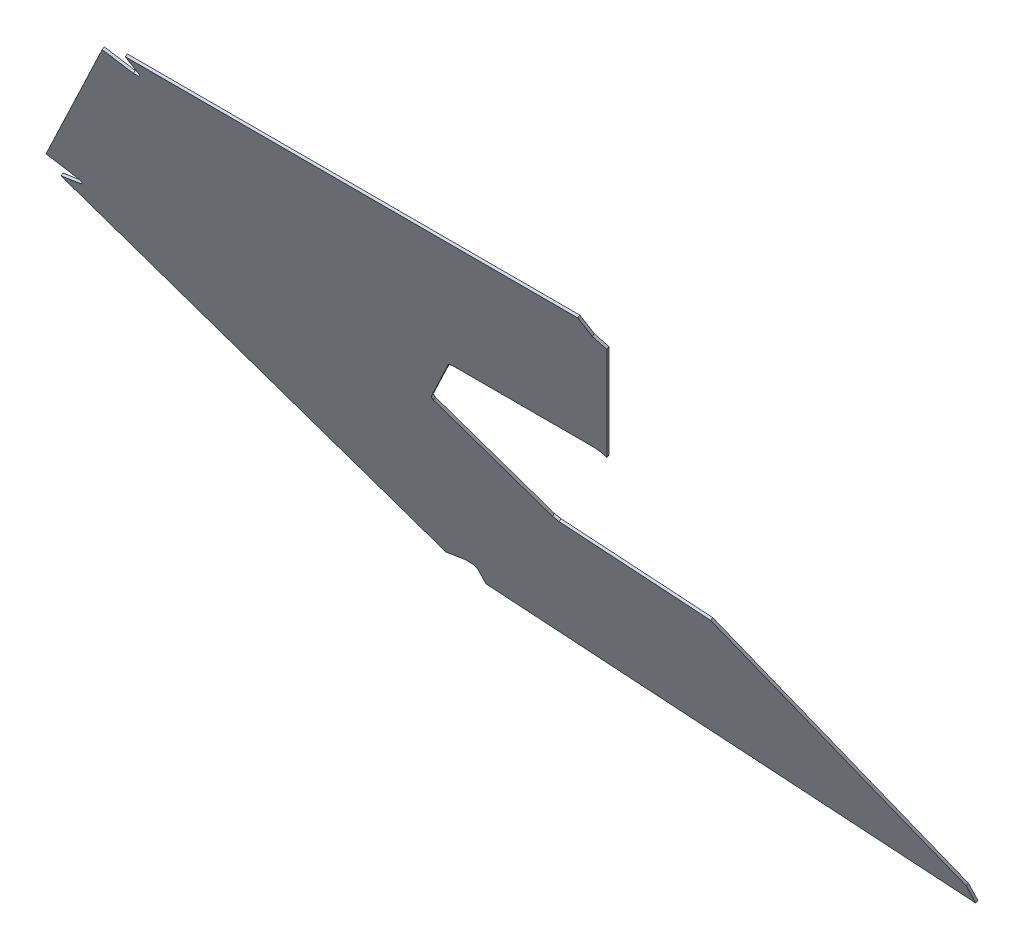
ISO-10303-21;
HEADER;
FILE_DESCRIPTION(('STEP AP214'),'2;1');
FILE_NAME('part.step','',(''),(''),'','','');
FILE_SCHEMA(('AUTOMOTIVE_DESIGN { 1 0 10303 214 1 1 1 1 }'));
ENDSEC;
DATA;
#1=APPLICATION_CONTEXT('core data for automotive mechanical design processes');
#2=APPLICATION_PROTOCOL_DEFINITION('international standard','automotive_design',2000,#1);
#3=PRODUCT_CONTEXT('',#1,'mechanical');
#4=PRODUCT('Part','Part','',(#3));
#5=PRODUCT_RELATED_PRODUCT_CATEGORY('part','',(#4));
#6=PRODUCT_DEFINITION_FORMATION('','',#4);
#7=PRODUCT_DEFINITION_CONTEXT('part definition',#1,'design');
#8=PRODUCT_DEFINITION('design','',#6,#7);
#9=PRODUCT_DEFINITION_SHAPE('','',#8);
#10=(LENGTH_UNIT() NAMED_UNIT(*) SI_UNIT(.MILLI.,.METRE.));
#11=(NAMED_UNIT(*) PLANE_ANGLE_UNIT() SI_UNIT($,.RADIAN.));
#12=(NAMED_UNIT(*) SI_UNIT($,.STERADIAN.) SOLID_ANGLE_UNIT());
#13=UNCERTAINTY_MEASURE_WITH_UNIT(LENGTH_MEASURE(1.E-05),#10,'distance_accuracy_value','');
#14=(GEOMETRIC_REPRESENTATION_CONTEXT(3) GLOBAL_UNCERTAINTY_ASSIGNED_CONTEXT((#13)) GLOBAL_UNIT_ASSIGNED_CONTEXT((#10,
#11,#12)) REPRESENTATION_CONTEXT('',''));
#15=CARTESIAN_POINT('',(0.,0.,0.));
#16=DIRECTION('',(0.,0.,1.));
#17=DIRECTION('',(1.,0.,0.));
#18=AXIS2_PLACEMENT_3D('',#15,#16,#17);
#19=CARTESIAN_POINT('',(-135.924925472236,149.206491038012,138.895088820437));
#20=DIRECTION('',(0.,-0.84861809948623,-0.529005974658491));
#21=DIRECTION('',(0.,0.529005974658491,-0.84861809948623));
#22=AXIS2_PLACEMENT_3D('',#19,#20,#21);
#23=PLANE('',#22);
#24=DIRECTION('',(0.,-0.529005974658491,0.84861809948623));
#25=VECTOR('',#24,1.);
#26=CARTESIAN_POINT('',(-137.927159041104,149.206491038012,138.895088820437));
#27=LINE('',#26,#25);
#28=CARTESIAN_POINT('',(-137.927159041104,150.,137.622161671208));
#29=VERTEX_POINT('',#28);
#30=CARTESIAN_POINT('',(-137.927159041104,149.206491038012,138.895088820437));
#31=VERTEX_POINT('',#30);
#32=EDGE_CURVE('E511',#29,#31,#27,.T.);
#33=ORIENTED_EDGE('',*,*,#32,.F.);
#34=DIRECTION('',(-1.,0.,0.));
#35=VECTOR('',#34,1.);
#36=CARTESIAN_POINT('',(-138.705215857703,150.,137.622161671208));
#37=LINE('',#36,#35);
#38=CARTESIAN_POINT('',(-141.48550624317,150.,137.622161671208));
#39=VERTEX_POINT('',#38);
#40=EDGE_CURVE('E497',#29,#39,#37,.T.);
#41=ORIENTED_EDGE('',*,*,#40,.T.);
#42=DIRECTION('',(0.,0.529005974658491,-0.84861809948623));
#43=VECTOR('',#42,1.);
#44=CARTESIAN_POINT('',(-141.48550624317,149.206491038012,138.895088820437));
#45=LINE('',#44,#43);
#46=CARTESIAN_POINT('',(-141.48550624317,149.206491038012,138.895088820437));
#47=VERTEX_POINT('',#46);
#48=EDGE_CURVE('E546',#47,#39,#45,.T.);
#49=ORIENTED_EDGE('',*,*,#48,.F.);
#50=DIRECTION('',(-1.,0.,0.));
#51=VECTOR('',#50,1.);
#52=CARTESIAN_POINT('',(-138.705215857703,149.206491038012,138.895088820437));
#53=LINE('',#52,#51);
#54=EDGE_CURVE('E507',#31,#47,#53,.T.);
#55=ORIENTED_EDGE('',*,*,#54,.F.);
#56=EDGE_LOOP('',(#33,#41,#49,#55));
#57=FACE_BOUND('',#56,.T.);
#58=ADVANCED_FACE('F295',(#57),#23,.F.);
#59=CARTESIAN_POINT('',(-291.319838155065,-42.0353497129346,19.6800067674046));
#60=DIRECTION('',(0.826670440896687,-0.477505861416198,-0.297664466238164));
#61=DIRECTION('',(0.500178684377504,0.86592221572979,0.));
#62=AXIS2_PLACEMENT_3D('',#59,#60,#61);
#63=PLANE('',#62);
#64=DIRECTION('',(0.,-0.529005974658488,0.848618099486231));
#65=VECTOR('',#64,1.);
#66=CARTESIAN_POINT('',(-292.446473825343,-43.4399791951513,18.8043980704843));
#67=LINE('',#66,#65);
#68=CARTESIAN_POINT('',(-292.446473825343,-42.6464702331635,17.5314709212548));
#69=VERTEX_POINT('',#68);
#70=CARTESIAN_POINT('',(-292.446473825343,-43.4399791951513,18.8043980704843));
#71=VERTEX_POINT('',#70);
#72=EDGE_CURVE('E539',#69,#71,#67,.T.);
#73=ORIENTED_EDGE('',*,*,#72,.F.);
#74=DIRECTION('',(-0.562686397692068,-0.701527498455186,-0.437313602307923));
#75=VECTOR('',#74,1.);
#76=CARTESIAN_POINT('',(-292.884232786359,-43.1922448424441,17.1912495315613));
#77=LINE('',#76,#75);
#78=CARTESIAN_POINT('',(-294.448627417653,-45.1426489339414,15.9754194449474));
#79=VERTEX_POINT('',#78);
#80=EDGE_CURVE('E547',#69,#79,#77,.T.);
#81=ORIENTED_EDGE('',*,*,#80,.T.);
#82=DIRECTION('',(0.,0.529005974658494,-0.848618099486227));
#83=VECTOR('',#82,1.);
#84=CARTESIAN_POINT('',(-294.448627417653,-45.9361578959292,17.2483465941768));
#85=LINE('',#84,#83);
#86=CARTESIAN_POINT('',(-294.448627417653,-45.9361578959292,17.2483465941768));
#87=VERTEX_POINT('',#86);
#88=EDGE_CURVE('E553',#87,#79,#85,.T.);
#89=ORIENTED_EDGE('',*,*,#88,.F.);
#90=DIRECTION('',(-0.562686397692068,-0.701527498455186,-0.437313602307923));
#91=VECTOR('',#90,1.);
#92=CARTESIAN_POINT('',(-292.884232786359,-43.9857538044319,18.4641766807907));
#93=LINE('',#92,#91);
#94=EDGE_CURVE('E550',#71,#87,#93,.T.);
#95=ORIENTED_EDGE('',*,*,#94,.F.);
#96=EDGE_LOOP('',(#73,#81,#89,#95));
#97=FACE_BOUND('',#96,.T.);
#98=ADVANCED_FACE('F836',(#97),#63,.F.);
#99=CARTESIAN_POINT('',(-192.472405328385,-258.661522412895,-115.358993337661));
#100=DIRECTION('',(0.930326469148009,0.311215761092928,0.194003636177128));
#101=DIRECTION('',(-0.317243123483603,0.948344241613966,0.));
#102=AXIS2_PLACEMENT_3D('',#99,#100,#101);
#103=PLANE('',#102);
#104=DIRECTION('',(0.,-0.529005974658494,0.848618099486228));
#105=VECTOR('',#104,1.);
#106=CARTESIAN_POINT('',(-191.738105450346,-260.242303862646,-116.344410490623));
#107=LINE('',#106,#105);
#108=CARTESIAN_POINT('',(-191.738105450346,-259.448794900658,-117.617337639852));
#109=VERTEX_POINT('',#108);
#110=CARTESIAN_POINT('',(-191.738105450346,-260.242303862646,-116.344410490623));
#111=VERTEX_POINT('',#110);
#112=EDGE_CURVE('E812',#109,#111,#107,.T.);
#113=ORIENTED_EDGE('',*,*,#112,.F.);
#114=DIRECTION('',(0.366732410352014,-0.789491880150111,-0.492148260562246));
#115=VECTOR('',#114,1.);
#116=CARTESIAN_POINT('',(-191.452834015736,-260.062919736386,-118.000166744585));
#117=LINE('',#116,#115);
#118=CARTESIAN_POINT('',(-190.433262703087,-262.257826021865,-119.368413002279));
#119=VERTEX_POINT('',#118);
#120=EDGE_CURVE('E554',#109,#119,#117,.T.);
#121=ORIENTED_EDGE('',*,*,#120,.T.);
#122=DIRECTION('',(0.,0.529005974658501,-0.848618099486223));
#123=VECTOR('',#122,1.);
#124=CARTESIAN_POINT('',(-190.433262703087,-263.051334983853,-118.09548585305));
#125=LINE('',#124,#123);
#126=CARTESIAN_POINT('',(-190.433262703087,-263.051334983853,-118.09548585305));
#127=VERTEX_POINT('',#126);
#128=EDGE_CURVE('E561',#127,#119,#125,.T.);
#129=ORIENTED_EDGE('',*,*,#128,.F.);
#130=DIRECTION('',(0.366732410352014,-0.789491880150111,-0.492148260562246));
#131=VECTOR('',#130,1.);
#132=CARTESIAN_POINT('',(-191.452834015736,-260.856428698374,-116.727239595355));
#133=LINE('',#132,#131);
#134=EDGE_CURVE('E558',#111,#127,#133,.T.);
#135=ORIENTED_EDGE('',*,*,#134,.F.);
#136=EDGE_LOOP('',(#113,#121,#129,#135));
#137=FACE_BOUND('',#136,.T.);
#138=ADVANCED_FACE('F863',(#137),#103,.F.);
#139=CARTESIAN_POINT('',(-61.7005414039403,-130.38739208721,-37.1638884057911));
#140=DIRECTION('',(0.930326469148015,0.311215761092918,0.19400363617712));
#141=DIRECTION('',(-0.366732410352,0.789491880150122,0.492148260562239));
#142=AXIS2_PLACEMENT_3D('',#139,#140,#141);
#143=PLANE('',#142);
#144=DIRECTION('',(0.,-0.529005974658493,0.848618099486229));
#145=VECTOR('',#144,1.);
#146=CARTESIAN_POINT('',(-62.3229953333624,-129.047389651716,-36.3285664925978));
#147=LINE('',#146,#145);
#148=CARTESIAN_POINT('',(-62.3229953333623,-129.047389651716,-36.3285664925978));
#149=VERTEX_POINT('',#148);
#150=CARTESIAN_POINT('',(-62.3229953333623,-129.840898613704,-35.0556393433685));
#151=VERTEX_POINT('',#150);
#152=EDGE_CURVE('E570',#149,#151,#147,.T.);
#153=ORIENTED_EDGE('',*,*,#152,.F.);
#154=DIRECTION('',(-0.366732410352,0.789491880150122,0.492148260562239));
#155=VECTOR('',#154,1.);
#156=CARTESIAN_POINT('',(-61.7005414039403,-130.38739208721,-37.1638884057911));
#157=LINE('',#156,#155);
#158=CARTESIAN_POINT('',(-92.9838071737008,-63.0416009527465,4.81768834799605));
#159=VERTEX_POINT('',#158);
#160=EDGE_CURVE('E574',#149,#159,#157,.T.);
#161=ORIENTED_EDGE('',*,*,#160,.T.);
#162=DIRECTION('',(0.,-0.529005974658492,0.848618099486229));
#163=VECTOR('',#162,1.);
#164=CARTESIAN_POINT('',(-92.9838071737008,-63.0416009527465,4.81768834799604));
#165=LINE('',#164,#163);
#166=CARTESIAN_POINT('',(-92.9838071737008,-63.8351099147342,6.09061549722537));
#167=VERTEX_POINT('',#166);
#168=EDGE_CURVE('E566',#159,#167,#165,.T.);
#169=ORIENTED_EDGE('',*,*,#168,.T.);
#170=DIRECTION('',(0.366732410352001,-0.789491880150122,-0.492148260562239));
#171=VECTOR('',#170,1.);
#172=CARTESIAN_POINT('',(-77.4274400665708,-97.3244475599271,-14.7857477483715));
#173=LINE('',#172,#171);
#174=EDGE_CURVE('E573',#151,#167,#173,.F.);
#175=ORIENTED_EDGE('',*,*,#174,.F.);
#176=EDGE_LOOP('',(#153,#161,#169,#175));
#177=FACE_BOUND('',#176,.T.);
#178=ADVANCED_FACE('F871',(#177),#143,.T.);
#179=CARTESIAN_POINT('',(-56.3241818783111,-90.2649186994679,-10.3850250349177));
#180=DIRECTION('',(0.,-0.529005974658493,0.848618099486229));
#181=DIRECTION('',(-0.930326469148015,-0.311215761092918,-0.19400363617712));
#182=AXIS2_PLACEMENT_3D('',#179,#180,#181);
#183=PLANE('',#182);
#184=DIRECTION('',(-0.562686397692096,-0.701527498455173,-0.437313602307909));
#185=VECTOR('',#184,1.);
#186=CARTESIAN_POINT('',(-137.489357053772,149.752319290217,139.235343649704));
#187=LINE('',#186,#185);
#188=CARTESIAN_POINT('',(-135.924925472236,151.702769449313,140.451202453635));
#189=VERTEX_POINT('',#188);
#190=EDGE_CURVE('E521',#189,#31,#187,.T.);
#191=ORIENTED_EDGE('',*,*,#190,.T.);
#192=ORIENTED_EDGE('',*,*,#54,.T.);
#193=DIRECTION('',(-0.826670440896674,0.477505861416217,0.297664466238173));
#194=VECTOR('',#193,1.);
#195=CARTESIAN_POINT('',(-154.606896724331,156.785739738243,143.619791072572));
#196=LINE('',#195,#194);
#197=CARTESIAN_POINT('',(-155.226899555003,157.143869134305,143.84303942225));
#198=VERTEX_POINT('',#197);
#199=EDGE_CURVE('E700',#47,#198,#196,.T.);
#200=ORIENTED_EDGE('',*,*,#199,.T.);
#201=DIRECTION('',(0.562686397692089,0.701527498455176,0.437313602307913));
#202=VECTOR('',#201,1.);
#203=CARTESIAN_POINT('',(-231.359924314881,62.2252597122773,84.6733003830657));
#204=LINE('',#203,#202);
#205=CARTESIAN_POINT('',(-307.492949074759,-32.6933497097506,25.5035613438811));
#206=VERTEX_POINT('',#205);
#207=EDGE_CURVE('E693',#198,#206,#204,.F.);
#208=ORIENTED_EDGE('',*,*,#207,.T.);
#209=DIRECTION('',(-0.826670440896674,0.477505861416217,0.297664466238173));
#210=VECTOR('',#209,1.);
#211=CARTESIAN_POINT('',(-306.872946244087,-33.0514791058127,25.2803129942025));
#212=LINE('',#211,#210);
#213=CARTESIAN_POINT('',(-293.751368698165,-40.6308358594047,20.5555433844736));
#214=VERTEX_POINT('',#213);
#215=EDGE_CURVE('E697',#206,#214,#212,.F.);
#216=ORIENTED_EDGE('',*,*,#215,.T.);
#217=DIRECTION('',(0.366732410351994,-0.789491880150125,-0.492148260562239));
#218=VECTOR('',#217,1.);
#219=CARTESIAN_POINT('',(-292.731773301356,-42.8257939926283,19.1872648062728));
#220=LINE('',#219,#218);
#221=EDGE_CURVE('E529',#214,#71,#220,.T.);
#222=ORIENTED_EDGE('',*,*,#221,.T.);
#223=ORIENTED_EDGE('',*,*,#94,.T.);
#224=DIRECTION('',(0.930326469148015,0.311215761092918,0.19400363617712));
#225=VECTOR('',#224,1.);
#226=CARTESIAN_POINT('',(-300.11495995718,-47.8316774284533,16.0667300832936));
#227=LINE('',#226,#225);
#228=CARTESIAN_POINT('',(-309.913231713534,-51.109426372694,14.0234684842495));
#229=VERTEX_POINT('',#228);
#230=EDGE_CURVE('E582',#229,#87,#227,.T.);
#231=ORIENTED_EDGE('',*,*,#230,.F.);
#232=DIRECTION('',(0.366732410352,-0.789491880150123,-0.492148260562239));
#233=VECTOR('',#232,1.);
#234=CARTESIAN_POINT('',(-260.293345425453,-157.929811516215,-52.5655212986167));
#235=LINE('',#234,#233);
#236=CARTESIAN_POINT('',(-210.673459137371,-264.750196659736,-119.154511081483));
#237=VERTEX_POINT('',#236);
#238=EDGE_CURVE('E605',#229,#237,#235,.T.);
#239=ORIENTED_EDGE('',*,*,#238,.T.);
#240=DIRECTION('',(0.930326469148015,0.311215761092914,0.194003636177126));
#241=VECTOR('',#240,1.);
#242=CARTESIAN_POINT('',(-209.97571428551,-264.516784838917,-119.00900835435));
#243=LINE('',#242,#241);
#244=CARTESIAN_POINT('',(-195.208644317869,-259.576857757942,-115.929589070464));
#245=VERTEX_POINT('',#244);
#246=EDGE_CURVE('E586',#237,#245,#243,.T.);
#247=ORIENTED_EDGE('',*,*,#246,.T.);
#248=DIRECTION('',(0.97541185463204,-0.187026869291456,-0.116587580840848));
#249=VECTOR('',#248,1.);
#250=CARTESIAN_POINT('',(-192.496852512923,-260.096820611624,-116.253720097559));
#251=LINE('',#250,#249);
#252=EDGE_CURVE('E538',#245,#111,#251,.T.);
#253=ORIENTED_EDGE('',*,*,#252,.T.);
#254=ORIENTED_EDGE('',*,*,#134,.T.);
#255=DIRECTION('',(0.220389913206769,0.827752154294173,0.515998698853078));
#256=VECTOR('',#255,1.);
#257=CARTESIAN_POINT('',(-193.931511303352,-276.190243080837,-126.285932047871));
#258=LINE('',#257,#256);
#259=CARTESIAN_POINT('',(-194.096803738257,-276.811057196558,-126.672931072011));
#260=VERTEX_POINT('',#259);
#261=EDGE_CURVE('E640',#127,#260,#258,.F.);
#262=ORIENTED_EDGE('',*,*,#261,.T.);
#263=DIRECTION('',(0.975411854632038,-0.187026869291462,-0.116587580840849));
#264=VECTOR('',#263,1.);
#265=CARTESIAN_POINT('',(-62.0247204976167,-302.134748037507,-142.459047068568));
#266=LINE('',#265,#264);
#267=CARTESIAN_POINT('',(70.0473627430238,-327.458438878456,-158.245163065124));
#268=VERTEX_POINT('',#267);
#269=EDGE_CURVE('E633',#260,#268,#266,.T.);
#270=ORIENTED_EDGE('',*,*,#269,.T.);
#271=DIRECTION('',(0.220389913206769,0.827752154294173,0.515998698853078));
#272=VECTOR('',#271,1.);
#273=CARTESIAN_POINT('',(70.2126551779289,-326.837624762735,-157.858164040984));
#274=LINE('',#273,#272);
#275=CARTESIAN_POINT('',(74.3591057733041,-311.264165147203,-148.150083117767));
#276=VERTEX_POINT('',#275);
#277=EDGE_CURVE('E637',#268,#276,#274,.T.);
#278=ORIENTED_EDGE('',*,*,#277,.T.);
#279=DIRECTION('',(0.261313668298405,-0.819131963238155,-0.510625100795131));
#280=VECTOR('',#279,1.);
#281=CARTESIAN_POINT('',(22.1064989521357,-147.469516790509,-46.0448515062358));
#282=LINE('',#281,#280);
#283=CARTESIAN_POINT('',(22.1064989521357,-147.469516790509,-46.0448515062358));
#284=VERTEX_POINT('',#283);
#285=EDGE_CURVE('E655',#284,#276,#282,.T.);
#286=ORIENTED_EDGE('',*,*,#285,.F.);
#287=DIRECTION('',(0.975411854632038,-0.187026869291462,-0.116587580840849));
#288=VECTOR('',#287,1.);
#289=CARTESIAN_POINT('',(-19.4617963315954,-139.499152178084,-41.0763379867476));
#290=LINE('',#289,#288);
#291=CARTESIAN_POINT('',(-59.6356507129541,-131.796159666114,-36.2744971303618));
#292=VERTEX_POINT('',#291);
#293=EDGE_CURVE('E615',#284,#292,#290,.F.);
#294=ORIENTED_EDGE('',*,*,#293,.T.);
#295=DIRECTION('',(0.759170788013354,-0.552358288050502,-0.344325480104366));
#296=VECTOR('',#295,1.);
#297=CARTESIAN_POINT('',(-62.3229953333624,-129.840898613704,-35.0556393433685));
#298=LINE('',#297,#296);
#299=EDGE_CURVE('E611',#151,#292,#298,.T.);
#300=ORIENTED_EDGE('',*,*,#299,.F.);
#301=ORIENTED_EDGE('',*,*,#174,.T.);
#302=DIRECTION('',(-0.110837710492343,-0.84338935522615,-0.525746514419292));
#303=VECTOR('',#302,1.);
#304=CARTESIAN_POINT('',(-92.5914674242177,-60.8497075018166,7.951636036558));
#305=LINE('',#304,#303);
#306=CARTESIAN_POINT('',(-92.5914674242178,-60.8497075018166,7.95163603655801));
#307=VERTEX_POINT('',#306);
#308=EDGE_CURVE('E672',#307,#167,#305,.T.);
#309=ORIENTED_EDGE('',*,*,#308,.F.);
#310=DIRECTION('',(0.562686397692089,0.701527498455176,0.437313602307913));
#311=VECTOR('',#310,1.);
#312=CARTESIAN_POINT('',(-69.4163185592819,-31.9561634669359,25.9631036599377));
#313=LINE('',#312,#311);
#314=CARTESIAN_POINT('',(-45.5477742728823,-2.19813086887885,44.5134704833476));
#315=VERTEX_POINT('',#314);
#316=EDGE_CURVE('E710',#307,#315,#313,.T.);
#317=ORIENTED_EDGE('',*,*,#316,.T.);
#318=DIRECTION('',(-0.88393619613977,-0.396820212544078,-0.247367176622984));
#319=VECTOR('',#318,1.);
#320=CARTESIAN_POINT('',(-42.4189111098094,-0.793508961987762,45.3890744580112));
#321=LINE('',#320,#319);
#322=CARTESIAN_POINT('',(-42.4189111098094,-0.793508961987748,45.3890744580112));
#323=VERTEX_POINT('',#322);
#324=EDGE_CURVE('E717',#323,#315,#321,.T.);
#325=ORIENTED_EDGE('',*,*,#324,.F.);
#326=DIRECTION('',(1.,0.,0.));
#327=VECTOR('',#326,1.);
#328=CARTESIAN_POINT('',(0.,-0.793508961987745,45.3890744580112));
#329=LINE('',#328,#327);
#330=CARTESIAN_POINT('',(43.6866164883155,-0.793508961987745,45.3890744580112));
#331=VERTEX_POINT('',#330);
#332=EDGE_CURVE('E754',#323,#331,#329,.T.);
#333=ORIENTED_EDGE('',*,*,#332,.T.);
#334=DIRECTION('',(-0.883943798762416,0.396808016367884,0.247359573850809));
#335=VECTOR('',#334,1.);
#336=CARTESIAN_POINT('',(46.8155722112643,-2.19811716837434,44.5134790238781));
#337=LINE('',#336,#335);
#338=CARTESIAN_POINT('',(46.8155722112642,-2.19811716837429,44.5134790238782));
#339=VERTEX_POINT('',#338);
#340=EDGE_CURVE('E761',#339,#331,#337,.T.);
#341=ORIENTED_EDGE('',*,*,#340,.F.);
#342=DIRECTION('',(-0.562718053530531,0.7015092124855,0.437302203320296));
#343=VECTOR('',#342,1.);
#344=CARTESIAN_POINT('',(70.685424919751,-31.9553312307571,25.9636224538582));
#345=LINE('',#344,#343);
#346=CARTESIAN_POINT('',(48.6740626445397,-4.51499353670675,43.0691998573898));
#347=VERTEX_POINT('',#346);
#348=EDGE_CURVE('E791',#339,#347,#345,.F.);
#349=ORIENTED_EDGE('',*,*,#348,.T.);
#350=DIRECTION('',(-0.467560526394548,-0.750145354066458,-0.467620681674969));
#351=VECTOR('',#350,1.);
#352=CARTESIAN_POINT('',(142.168048282114,145.485006463293,136.575214219816));
#353=LINE('',#352,#351);
#354=CARTESIAN_POINT('',(142.168048282114,145.485006463293,136.575214219816));
#355=VERTEX_POINT('',#354);
#356=EDGE_CURVE('E775',#355,#347,#353,.T.);
#357=ORIENTED_EDGE('',*,*,#356,.F.);
#358=DIRECTION('',(-0.562718053530531,0.7015092124855,0.437302203320296));
#359=VECTOR('',#358,1.);
#360=CARTESIAN_POINT('',(216.796932952747,52.4493382711996,78.5792507118962));
#361=LINE('',#360,#359);
#362=CARTESIAN_POINT('',(137.180602125889,151.702577418082,140.451082746469));
#363=VERTEX_POINT('',#362);
#364=EDGE_CURVE('E787',#363,#355,#361,.F.);
#365=ORIENTED_EDGE('',*,*,#364,.F.);
#366=DIRECTION('',(0.,0.848618099486232,0.529005974658487));
#367=VECTOR('',#366,1.);
#368=CARTESIAN_POINT('',(137.180602125889,165.17252583816,148.847890682662));
#369=LINE('',#368,#367);
#370=CARTESIAN_POINT('',(137.180602125889,165.808989412775,149.244645163655));
#371=VERTEX_POINT('',#370);
#372=EDGE_CURVE('E745',#363,#371,#369,.T.);
#373=ORIENTED_EDGE('',*,*,#372,.T.);
#374=DIRECTION('',(1.,0.,0.));
#375=VECTOR('',#374,1.);
#376=CARTESIAN_POINT('',(0.627838326826915,165.808989412775,149.244645163655));
#377=LINE('',#376,#375);
#378=CARTESIAN_POINT('',(-135.924925472236,165.808989412775,149.244645163655));
#379=VERTEX_POINT('',#378);
#380=EDGE_CURVE('E740',#371,#379,#377,.F.);
#381=ORIENTED_EDGE('',*,*,#380,.T.);
#382=DIRECTION('',(0.,0.848618099486232,0.529005974658487));
#383=VECTOR('',#382,1.);
#384=CARTESIAN_POINT('',(-135.924925472236,165.17252583816,148.847890682662));
#385=LINE('',#384,#383);
#386=EDGE_CURVE('E313',#379,#189,#385,.F.);
#387=ORIENTED_EDGE('',*,*,#386,.T.);
#388=EDGE_LOOP('',(#191,#192,#200,#208,#216,#222,#223,#231,#239,#247,#253,#254,#262,#270,#278,
#286,#294,#300,#301,#309,#317,#325,#333,#341,#349,#357,#365,#373,#381,#387));
#389=FACE_BOUND('',#388,.T.);
#390=ADVANCED_FACE('F837',(#389),#183,.T.);
#391=CARTESIAN_POINT('',(0.,-19.8047992922429,31.770361661679));
#392=DIRECTION('',(0.,-0.529005974658493,0.848618099486228));
#393=DIRECTION('',(0.,-0.848618099486228,-0.529005974658493));
#394=AXIS2_PLACEMENT_3D('',#391,#392,#393);
#395=PLANE('',#394);
#396=ORIENTED_EDGE('',*,*,#40,.F.);
#397=DIRECTION('',(-0.562686397692096,-0.701527498455173,-0.437313602307909));
#398=VECTOR('',#397,1.);
#399=CARTESIAN_POINT('',(-137.489357053772,150.545828252205,137.962416500475));
#400=LINE('',#399,#398);
#401=CARTESIAN_POINT('',(-135.924925472236,152.496278411301,139.178275304406));
#402=VERTEX_POINT('',#401);
#403=EDGE_CURVE('E299',#402,#29,#400,.T.);
#404=ORIENTED_EDGE('',*,*,#403,.F.);
#405=DIRECTION('',(0.,-0.848618099486232,-0.529005974658487));
#406=VECTOR('',#405,1.);
#407=CARTESIAN_POINT('',(-135.924925472236,165.966034800148,147.574963533432));
#408=LINE('',#407,#406);
#409=CARTESIAN_POINT('',(-135.924925472236,166.602498374763,147.971718014426));
#410=VERTEX_POINT('',#409);
#411=EDGE_CURVE('E320',#410,#402,#408,.T.);
#412=ORIENTED_EDGE('',*,*,#411,.F.);
#413=DIRECTION('',(-1.,0.,0.));
#414=VECTOR('',#413,1.);
#415=CARTESIAN_POINT('',(0.627838326826914,166.602498374763,147.971718014426));
#416=LINE('',#415,#414);
#417=CARTESIAN_POINT('',(137.180602125889,166.602498374763,147.971718014426));
#418=VERTEX_POINT('',#417);
#419=EDGE_CURVE('E736',#418,#410,#416,.T.);
#420=ORIENTED_EDGE('',*,*,#419,.F.);
#421=DIRECTION('',(0.,0.848618099486232,0.529005974658487));
#422=VECTOR('',#421,1.);
#423=CARTESIAN_POINT('',(137.180602125889,165.966034800148,147.574963533432));
#424=LINE('',#423,#422);
#425=CARTESIAN_POINT('',(137.180602125889,152.49608638007,139.178155597239));
#426=VERTEX_POINT('',#425);
#427=EDGE_CURVE('E728',#426,#418,#424,.T.);
#428=ORIENTED_EDGE('',*,*,#427,.F.);
#429=DIRECTION('',(0.562718053530531,-0.701509212485499,-0.437302203320296));
#430=VECTOR('',#429,1.);
#431=CARTESIAN_POINT('',(139.354458014461,149.786061487709,137.488798087188));
#432=LINE('',#431,#430);
#433=CARTESIAN_POINT('',(142.168048282114,146.278515425281,135.302287070587));
#434=VERTEX_POINT('',#433);
#435=EDGE_CURVE('E779',#426,#434,#432,.T.);
#436=ORIENTED_EDGE('',*,*,#435,.T.);
#437=DIRECTION('',(-0.467560526394548,-0.750145354066458,-0.467620681674969));
#438=VECTOR('',#437,1.);
#439=CARTESIAN_POINT('',(142.168048282114,146.278515425281,135.302287070587));
#440=LINE('',#439,#438);
#441=CARTESIAN_POINT('',(48.6740626445397,-3.72148457471902,41.7962727081604));
#442=VERTEX_POINT('',#441);
#443=EDGE_CURVE('E783',#434,#442,#440,.T.);
#444=ORIENTED_EDGE('',*,*,#443,.T.);
#445=DIRECTION('',(0.562718053530531,-0.701509212485499,-0.437302203320296));
#446=VECTOR('',#445,1.);
#447=CARTESIAN_POINT('',(45.8604723768871,-0.213938512291519,43.9827837247619));
#448=LINE('',#447,#446);
#449=CARTESIAN_POINT('',(46.8155722112642,-1.40460820638655,43.2405518746489));
#450=VERTEX_POINT('',#449);
#451=EDGE_CURVE('E795',#450,#442,#448,.T.);
#452=ORIENTED_EDGE('',*,*,#451,.F.);
#453=DIRECTION('',(-0.883943798762416,0.396808016367884,0.247359573850809));
#454=VECTOR('',#453,1.);
#455=CARTESIAN_POINT('',(46.8155722112643,-1.40460820638661,43.2405518746488));
#456=LINE('',#455,#454);
#457=CARTESIAN_POINT('',(43.6866164883155,0.,44.1161473087819));
#458=VERTEX_POINT('',#457);
#459=EDGE_CURVE('E729',#450,#458,#456,.T.);
#460=ORIENTED_EDGE('',*,*,#459,.T.);
#461=DIRECTION('',(1.,0.,0.));
#462=VECTOR('',#461,1.);
#463=CARTESIAN_POINT('',(-44.1161473087819,0.,44.1161473087819));
#464=LINE('',#463,#462);
#465=CARTESIAN_POINT('',(-42.4189111098094,0.,44.1161473087819));
#466=VERTEX_POINT('',#465);
#467=EDGE_CURVE('E720',#466,#458,#464,.T.);
#468=ORIENTED_EDGE('',*,*,#467,.F.);
#469=DIRECTION('',(-0.88393619613977,-0.396820212544078,-0.247367176622984));
#470=VECTOR('',#469,1.);
#471=CARTESIAN_POINT('',(-42.4189111098094,0.,44.1161473087819));
#472=LINE('',#471,#470);
#473=CARTESIAN_POINT('',(-45.5477742728823,-1.40462190689115,43.2405433341183));
#474=VERTEX_POINT('',#473);
#475=EDGE_CURVE('E683',#466,#474,#472,.T.);
#476=ORIENTED_EDGE('',*,*,#475,.T.);
#477=DIRECTION('',(0.562686397692089,0.701527498455176,0.437313602307913));
#478=VECTOR('',#477,1.);
#479=CARTESIAN_POINT('',(-93.5464791492616,-61.2468564075388,5.93648440946993));
#480=LINE('',#479,#478);
#481=CARTESIAN_POINT('',(-92.5914674242178,-60.0561985398289,6.67870888732867));
#482=VERTEX_POINT('',#481);
#483=EDGE_CURVE('E675',#482,#474,#480,.T.);
#484=ORIENTED_EDGE('',*,*,#483,.F.);
#485=DIRECTION('',(-0.110837710492343,-0.84338935522615,-0.525746514419292));
#486=VECTOR('',#485,1.);
#487=CARTESIAN_POINT('',(-92.5914674242177,-60.0561985398289,6.67870888732867));
#488=LINE('',#487,#486);
#489=EDGE_CURVE('E623',#482,#159,#488,.T.);
#490=ORIENTED_EDGE('',*,*,#489,.T.);
#491=ORIENTED_EDGE('',*,*,#160,.F.);
#492=DIRECTION('',(0.759170788013354,-0.552358288050502,-0.344325480104366));
#493=VECTOR('',#492,1.);
#494=CARTESIAN_POINT('',(-62.3229953333624,-129.047389651716,-36.3285664925978));
#495=LINE('',#494,#493);
#496=CARTESIAN_POINT('',(-59.635650712954,-131.002650704127,-37.5474242795912));
#497=VERTEX_POINT('',#496);
#498=EDGE_CURVE('E595',#149,#497,#495,.T.);
#499=ORIENTED_EDGE('',*,*,#498,.T.);
#500=DIRECTION('',(-0.975411854632038,0.187026869291462,0.116587580840849));
#501=VECTOR('',#500,1.);
#502=CARTESIAN_POINT('',(22.1064989521357,-146.676007828521,-47.3177786554651));
#503=LINE('',#502,#501);
#504=CARTESIAN_POINT('',(22.1064989521357,-146.676007828521,-47.3177786554651));
#505=VERTEX_POINT('',#504);
#506=EDGE_CURVE('E663',#505,#497,#503,.T.);
#507=ORIENTED_EDGE('',*,*,#506,.F.);
#508=DIRECTION('',(0.261313668298405,-0.819131963238155,-0.510625100795131));
#509=VECTOR('',#508,1.);
#510=CARTESIAN_POINT('',(22.1064989521357,-146.676007828521,-47.3177786554651));
#511=LINE('',#510,#509);
#512=CARTESIAN_POINT('',(74.3591057733041,-310.470656185215,-149.423010266996));
#513=VERTEX_POINT('',#512);
#514=EDGE_CURVE('E659',#505,#513,#511,.T.);
#515=ORIENTED_EDGE('',*,*,#514,.T.);
#516=DIRECTION('',(0.220389913206769,0.827752154294173,0.515998698853077));
#517=VECTOR('',#516,1.);
#518=CARTESIAN_POINT('',(70.2126551779289,-326.044115800747,-159.131091190214));
#519=LINE('',#518,#517);
#520=CARTESIAN_POINT('',(70.0473627430238,-326.664929916468,-159.518090214353));
#521=VERTEX_POINT('',#520);
#522=EDGE_CURVE('E622',#521,#513,#519,.T.);
#523=ORIENTED_EDGE('',*,*,#522,.F.);
#524=DIRECTION('',(0.975411854632038,-0.187026869291462,-0.116587580840849));
#525=VECTOR('',#524,1.);
#526=CARTESIAN_POINT('',(-62.0247204976166,-301.341239075519,-143.731974217797));
#527=LINE('',#526,#525);
#528=CARTESIAN_POINT('',(-194.096803738257,-276.01754823457,-127.945858221241));
#529=VERTEX_POINT('',#528);
#530=EDGE_CURVE('E629',#529,#521,#527,.T.);
#531=ORIENTED_EDGE('',*,*,#530,.F.);
#532=DIRECTION('',(-0.220389913206769,-0.827752154294173,-0.515998698853077));
#533=VECTOR('',#532,1.);
#534=CARTESIAN_POINT('',(-193.931511303352,-275.39673411885,-127.558859197101));
#535=LINE('',#534,#533);
#536=EDGE_CURVE('E648',#119,#529,#535,.T.);
#537=ORIENTED_EDGE('',*,*,#536,.F.);
#538=ORIENTED_EDGE('',*,*,#120,.F.);
#539=DIRECTION('',(0.97541185463204,-0.187026869291456,-0.116587580840848));
#540=VECTOR('',#539,1.);
#541=CARTESIAN_POINT('',(-192.496852512923,-259.303311649636,-117.526647246788));
#542=LINE('',#541,#540);
#543=CARTESIAN_POINT('',(-195.208644317869,-258.783348795954,-117.202516219693));
#544=VERTEX_POINT('',#543);
#545=EDGE_CURVE('E534',#544,#109,#542,.T.);
#546=ORIENTED_EDGE('',*,*,#545,.F.);
#547=DIRECTION('',(0.930326469148015,0.311215761092914,0.194003636177126));
#548=VECTOR('',#547,1.);
#549=CARTESIAN_POINT('',(-209.97571428551,-263.723275876929,-120.281935503579));
#550=LINE('',#549,#548);
#551=CARTESIAN_POINT('',(-210.673459137371,-263.956687697749,-120.427438230712));
#552=VERTEX_POINT('',#551);
#553=EDGE_CURVE('E602',#552,#544,#550,.T.);
#554=ORIENTED_EDGE('',*,*,#553,.F.);
#555=DIRECTION('',(0.366732410352001,-0.789491880150122,-0.492148260562239));
#556=VECTOR('',#555,1.);
#557=CARTESIAN_POINT('',(-260.293345425453,-157.136302554228,-53.8384484478461));
#558=LINE('',#557,#556);
#559=CARTESIAN_POINT('',(-309.913231713534,-50.3159174107063,12.7505413350202));
#560=VERTEX_POINT('',#559);
#561=EDGE_CURVE('E594',#560,#552,#558,.T.);
#562=ORIENTED_EDGE('',*,*,#561,.F.);
#563=DIRECTION('',(0.930326469148015,0.311215761092918,0.19400363617712));
#564=VECTOR('',#563,1.);
#565=CARTESIAN_POINT('',(-300.11495995718,-47.0381684664656,14.7938029340643));
#566=LINE('',#565,#564);
#567=EDGE_CURVE('E578',#560,#79,#566,.T.);
#568=ORIENTED_EDGE('',*,*,#567,.T.);
#569=ORIENTED_EDGE('',*,*,#80,.F.);
#570=DIRECTION('',(0.366732410351994,-0.789491880150125,-0.492148260562239));
#571=VECTOR('',#570,1.);
#572=CARTESIAN_POINT('',(-292.731773301356,-42.0322850306406,17.9143376570435));
#573=LINE('',#572,#571);
#574=CARTESIAN_POINT('',(-293.751368698165,-39.837326897417,19.2826162352443));
#575=VERTEX_POINT('',#574);
#576=EDGE_CURVE('E516',#575,#69,#573,.T.);
#577=ORIENTED_EDGE('',*,*,#576,.F.);
#578=DIRECTION('',(0.826670440896674,-0.477505861416217,-0.297664466238173));
#579=VECTOR('',#578,1.);
#580=CARTESIAN_POINT('',(-306.872946244087,-32.257970143825,24.0073858449731));
#581=LINE('',#580,#579);
#582=CARTESIAN_POINT('',(-307.492949074759,-31.8998407477629,24.2306341946518));
#583=VERTEX_POINT('',#582);
#584=EDGE_CURVE('E707',#583,#575,#581,.T.);
#585=ORIENTED_EDGE('',*,*,#584,.F.);
#586=DIRECTION('',(-0.562686397692089,-0.701527498455176,-0.437313602307913));
#587=VECTOR('',#586,1.);
#588=CARTESIAN_POINT('',(-231.359924314881,63.018768674265,83.4003732338364));
#589=LINE('',#588,#587);
#590=CARTESIAN_POINT('',(-155.226899555003,157.937378096293,142.570112273021));
#591=VERTEX_POINT('',#590);
#592=EDGE_CURVE('E689',#591,#583,#589,.T.);
#593=ORIENTED_EDGE('',*,*,#592,.F.);
#594=DIRECTION('',(-0.826670440896674,0.477505861416217,0.297664466238173));
#595=VECTOR('',#594,1.);
#596=CARTESIAN_POINT('',(-154.606896724331,157.579248700231,142.346863923342));
#597=LINE('',#596,#595);
#598=EDGE_CURVE('E502',#39,#591,#597,.T.);
#599=ORIENTED_EDGE('',*,*,#598,.F.);
#600=EDGE_LOOP('',(#396,#404,#412,#420,#428,#436,#444,#452,#460,#468,#476,#484,#490,#491,#499,
#507,#515,#523,#531,#537,#538,#546,#554,#562,#568,#569,#577,#585,#593,#599));
#601=FACE_BOUND('',#600,.T.);
#602=ADVANCED_FACE('F297',(#601),#395,.F.);
#603=CARTESIAN_POINT('',(-260.293345425453,-157.136302554228,-53.8384484478461));
#604=DIRECTION('',(0.930326469148015,0.311215761092914,0.194003636177126));
#605=DIRECTION('',(0.366732410352001,-0.789491880150122,-0.492148260562239));
#606=AXIS2_PLACEMENT_3D('',#603,#604,#605);
#607=PLANE('',#606);
#608=DIRECTION('',(0.,0.529005974658495,-0.848618099486228));
#609=VECTOR('',#608,1.);
#610=CARTESIAN_POINT('',(-210.673459137371,-263.956687697749,-120.427438230712));
#611=LINE('',#610,#609);
#612=EDGE_CURVE('E599',#237,#552,#611,.T.);
#613=ORIENTED_EDGE('',*,*,#612,.F.);
#614=ORIENTED_EDGE('',*,*,#238,.F.);
#615=DIRECTION('',(0.,0.529005974658495,-0.848618099486228));
#616=VECTOR('',#615,1.);
#617=CARTESIAN_POINT('',(-309.913231713534,-50.3159174107063,12.7505413350202));
#618=LINE('',#617,#616);
#619=EDGE_CURVE('E590',#229,#560,#618,.T.);
#620=ORIENTED_EDGE('',*,*,#619,.T.);
#621=ORIENTED_EDGE('',*,*,#561,.T.);
#622=EDGE_LOOP('',(#613,#614,#620,#621));
#623=FACE_BOUND('',#622,.T.);
#624=ADVANCED_FACE('F963',(#623),#607,.F.);
#625=CARTESIAN_POINT('',(-209.97571428551,-263.723275876929,-120.281935503579));
#626=DIRECTION('',(-0.366732410352001,0.789491880150122,0.492148260562239));
#627=DIRECTION('',(0.930326469148015,0.311215761092914,0.194003636177126));
#628=AXIS2_PLACEMENT_3D('',#625,#626,#627);
#629=PLANE('',#628);
#630=ORIENTED_EDGE('',*,*,#553,.T.);
#631=DIRECTION('',(0.,0.529005974658495,-0.848618099486227));
#632=VECTOR('',#631,1.);
#633=CARTESIAN_POINT('',(-195.208644317869,-259.576857757942,-115.929589070464));
#634=LINE('',#633,#632);
#635=EDGE_CURVE('E542',#245,#544,#634,.T.);
#636=ORIENTED_EDGE('',*,*,#635,.F.);
#637=ORIENTED_EDGE('',*,*,#246,.F.);
#638=ORIENTED_EDGE('',*,*,#612,.T.);
#639=EDGE_LOOP('',(#630,#636,#637,#638));
#640=FACE_BOUND('',#639,.T.);
#641=ADVANCED_FACE('F969',(#640),#629,.F.);
#642=CARTESIAN_POINT('',(-309.215486861673,-50.0825055898866,12.896044062153));
#643=DIRECTION('',(0.366732410352001,-0.789491880150122,-0.492148260562239));
#644=DIRECTION('',(-0.930326469148015,-0.311215761092914,-0.194003636177126));
#645=AXIS2_PLACEMENT_3D('',#642,#643,#644);
#646=PLANE('',#645);
#647=ORIENTED_EDGE('',*,*,#619,.F.);
#648=ORIENTED_EDGE('',*,*,#230,.T.);
#649=ORIENTED_EDGE('',*,*,#88,.T.);
#650=ORIENTED_EDGE('',*,*,#567,.F.);
#651=EDGE_LOOP('',(#647,#648,#649,#650));
#652=FACE_BOUND('',#651,.T.);
#653=ADVANCED_FACE('F968',(#652),#646,.F.);
#654=CARTESIAN_POINT('',(-62.3229953333624,-129.44414413271,-35.6921029179832));
#655=DIRECTION('',(0.650891476843247,0.644246071309355,0.401605882645261));
#656=DIRECTION('',(0.759170788013354,-0.552358288050502,-0.344325480104366));
#657=AXIS2_PLACEMENT_3D('',#654,#655,#656);
#658=PLANE('',#657);
#659=ORIENTED_EDGE('',*,*,#152,.T.);
#660=ORIENTED_EDGE('',*,*,#299,.T.);
#661=DIRECTION('',(0.,-0.529005974658498,0.848618099486226));
#662=VECTOR('',#661,1.);
#663=CARTESIAN_POINT('',(-59.6356507129541,-131.002650704127,-37.5474242795912));
#664=LINE('',#663,#662);
#665=EDGE_CURVE('E666',#497,#292,#664,.T.);
#666=ORIENTED_EDGE('',*,*,#665,.F.);
#667=ORIENTED_EDGE('',*,*,#498,.F.);
#668=EDGE_LOOP('',(#659,#660,#666,#667));
#669=FACE_BOUND('',#668,.T.);
#670=ADVANCED_FACE('F936',(#669),#658,.T.);
#671=CARTESIAN_POINT('',(70.2126551779289,-326.044115800747,-159.131091190214));
#672=DIRECTION('',(-0.975411854632038,0.187026869291462,0.116587580840849));
#673=DIRECTION('',(0.220389913206769,0.827752154294173,0.515998698853077));
#674=AXIS2_PLACEMENT_3D('',#671,#672,#673);
#675=PLANE('',#674);
#676=ORIENTED_EDGE('',*,*,#522,.T.);
#677=DIRECTION('',(0.,-0.529005974658495,0.848618099486227));
#678=VECTOR('',#677,1.);
#679=CARTESIAN_POINT('',(74.3591057733041,-310.470656185215,-149.423010266996));
#680=LINE('',#679,#678);
#681=EDGE_CURVE('E644',#513,#276,#680,.T.);
#682=ORIENTED_EDGE('',*,*,#681,.T.);
#683=ORIENTED_EDGE('',*,*,#277,.F.);
#684=DIRECTION('',(0.,0.529005974658501,-0.848618099486224));
#685=VECTOR('',#684,1.);
#686=CARTESIAN_POINT('',(70.0473627430238,-326.664929916468,-159.518090214353));
#687=LINE('',#686,#685);
#688=EDGE_CURVE('E619',#268,#521,#687,.T.);
#689=ORIENTED_EDGE('',*,*,#688,.T.);
#690=EDGE_LOOP('',(#676,#682,#683,#689));
#691=FACE_BOUND('',#690,.T.);
#692=ADVANCED_FACE('F947',(#691),#675,.F.);
#693=CARTESIAN_POINT('',(-62.0247204976166,-301.341239075519,-143.731974217797));
#694=DIRECTION('',(0.220389913206769,0.827752154294173,0.515998698853078));
#695=DIRECTION('',(0.975411854632038,-0.187026869291462,-0.116587580840849));
#696=AXIS2_PLACEMENT_3D('',#693,#694,#695);
#697=PLANE('',#696);
#698=ORIENTED_EDGE('',*,*,#688,.F.);
#699=ORIENTED_EDGE('',*,*,#269,.F.);
#700=DIRECTION('',(0.,0.529005974658501,-0.848618099486224));
#701=VECTOR('',#700,1.);
#702=CARTESIAN_POINT('',(-194.096803738257,-276.01754823457,-127.945858221241));
#703=LINE('',#702,#701);
#704=EDGE_CURVE('E626',#260,#529,#703,.T.);
#705=ORIENTED_EDGE('',*,*,#704,.T.);
#706=ORIENTED_EDGE('',*,*,#530,.T.);
#707=EDGE_LOOP('',(#698,#699,#705,#706));
#708=FACE_BOUND('',#707,.T.);
#709=ADVANCED_FACE('F951',(#708),#697,.F.);
#710=CARTESIAN_POINT('',(-193.931511303352,-275.39673411885,-127.558859197101));
#711=DIRECTION('',(0.975411854632038,-0.187026869291462,-0.116587580840849));
#712=DIRECTION('',(-0.220389913206769,-0.827752154294173,-0.515998698853077));
#713=AXIS2_PLACEMENT_3D('',#710,#711,#712);
#714=PLANE('',#713);
#715=ORIENTED_EDGE('',*,*,#261,.F.);
#716=ORIENTED_EDGE('',*,*,#128,.T.);
#717=ORIENTED_EDGE('',*,*,#536,.T.);
#718=ORIENTED_EDGE('',*,*,#704,.F.);
#719=EDGE_LOOP('',(#715,#716,#717,#718));
#720=FACE_BOUND('',#719,.T.);
#721=ADVANCED_FACE('F953',(#720),#714,.F.);
#722=CARTESIAN_POINT('',(22.1064989521357,-146.676007828521,-47.3177786554651));
#723=DIRECTION('',(-0.965253939002805,-0.221755508561168,-0.138236491789783));
#724=DIRECTION('',(0.261313668298405,-0.819131963238155,-0.510625100795131));
#725=AXIS2_PLACEMENT_3D('',#722,#723,#724);
#726=PLANE('',#725);
#727=ORIENTED_EDGE('',*,*,#681,.F.);
#728=ORIENTED_EDGE('',*,*,#514,.F.);
#729=DIRECTION('',(0.,-0.529005974658495,0.848618099486227));
#730=VECTOR('',#729,1.);
#731=CARTESIAN_POINT('',(22.1064989521357,-146.676007828521,-47.3177786554651));
#732=LINE('',#731,#730);
#733=EDGE_CURVE('E652',#505,#284,#732,.T.);
#734=ORIENTED_EDGE('',*,*,#733,.T.);
#735=ORIENTED_EDGE('',*,*,#285,.T.);
#736=EDGE_LOOP('',(#727,#728,#734,#735));
#737=FACE_BOUND('',#736,.T.);
#738=ADVANCED_FACE('F943',(#737),#726,.F.);
#739=CARTESIAN_POINT('',(22.1064989521357,-146.676007828521,-47.3177786554651));
#740=DIRECTION('',(0.220389913206769,0.827752154294177,0.515998698853071));
#741=DIRECTION('',(-0.975411854632038,0.187026869291462,0.116587580840849));
#742=AXIS2_PLACEMENT_3D('',#739,#740,#741);
#743=PLANE('',#742);
#744=ORIENTED_EDGE('',*,*,#733,.F.);
#745=ORIENTED_EDGE('',*,*,#506,.T.);
#746=ORIENTED_EDGE('',*,*,#665,.T.);
#747=ORIENTED_EDGE('',*,*,#293,.F.);
#748=EDGE_LOOP('',(#744,#745,#746,#747));
#749=FACE_BOUND('',#748,.T.);
#750=ADVANCED_FACE('F853',(#749),#743,.T.);
#751=CARTESIAN_POINT('',(-92.5914674242177,-60.4529530208228,7.31517246194333));
#752=DIRECTION('',(0.993838519042614,-0.0940588872294175,-0.058633811067916));
#753=DIRECTION('',(-0.110837710492343,-0.84338935522615,-0.525746514419292));
#754=AXIS2_PLACEMENT_3D('',#751,#752,#753);
#755=PLANE('',#754);
#756=DIRECTION('',(0.,-0.529005974658494,0.848618099486228));
#757=VECTOR('',#756,1.);
#758=CARTESIAN_POINT('',(-92.5914674242178,-60.0561985398289,6.67870888732867));
#759=LINE('',#758,#757);
#760=EDGE_CURVE('E679',#482,#307,#759,.T.);
#761=ORIENTED_EDGE('',*,*,#760,.T.);
#762=ORIENTED_EDGE('',*,*,#308,.T.);
#763=ORIENTED_EDGE('',*,*,#168,.F.);
#764=ORIENTED_EDGE('',*,*,#489,.F.);
#765=EDGE_LOOP('',(#761,#762,#763,#764));
#766=FACE_BOUND('',#765,.T.);
#767=ADVANCED_FACE('F845',(#766),#755,.T.);
#768=CARTESIAN_POINT('',(-154.606896724331,157.579248700231,142.346863923342));
#769=DIRECTION('',(-0.562686397692089,-0.701527498455176,-0.437313602307913));
#770=DIRECTION('',(-0.826670440896674,0.477505861416217,0.297664466238173));
#771=AXIS2_PLACEMENT_3D('',#768,#769,#770);
#772=PLANE('',#771);
#773=ORIENTED_EDGE('',*,*,#199,.F.);
#774=ORIENTED_EDGE('',*,*,#48,.T.);
#775=ORIENTED_EDGE('',*,*,#598,.T.);
#776=DIRECTION('',(0.,0.529005974658491,-0.84861809948623));
#777=VECTOR('',#776,1.);
#778=CARTESIAN_POINT('',(-155.226899555003,157.937378096293,142.570112273021));
#779=LINE('',#778,#777);
#780=EDGE_CURVE('E686',#198,#591,#779,.T.);
#781=ORIENTED_EDGE('',*,*,#780,.F.);
#782=EDGE_LOOP('',(#773,#774,#775,#781));
#783=FACE_BOUND('',#782,.T.);
#784=ADVANCED_FACE('F843',(#783),#772,.F.);
#785=CARTESIAN_POINT('',(-231.359924314881,63.018768674265,83.4003732338364));
#786=DIRECTION('',(0.826670440896674,-0.477505861416217,-0.297664466238173));
#787=DIRECTION('',(-0.562686397692089,-0.701527498455176,-0.437313602307913));
#788=AXIS2_PLACEMENT_3D('',#785,#786,#787);
#789=PLANE('',#788);
#790=DIRECTION('',(0.,0.529005974658491,-0.84861809948623));
#791=VECTOR('',#790,1.);
#792=CARTESIAN_POINT('',(-307.492949074759,-31.8998407477629,24.2306341946518));
#793=LINE('',#792,#791);
#794=EDGE_CURVE('E704',#206,#583,#793,.T.);
#795=ORIENTED_EDGE('',*,*,#794,.F.);
#796=ORIENTED_EDGE('',*,*,#207,.F.);
#797=ORIENTED_EDGE('',*,*,#780,.T.);
#798=ORIENTED_EDGE('',*,*,#592,.T.);
#799=EDGE_LOOP('',(#795,#796,#797,#798));
#800=FACE_BOUND('',#799,.T.);
#801=ADVANCED_FACE('F841',(#800),#789,.F.);
#802=CARTESIAN_POINT('',(-306.872946244087,-32.257970143825,24.0073858449731));
#803=DIRECTION('',(0.562686397692089,0.701527498455176,0.437313602307913));
#804=DIRECTION('',(0.826670440896674,-0.477505861416217,-0.297664466238173));
#805=AXIS2_PLACEMENT_3D('',#802,#803,#804);
#806=PLANE('',#805);
#807=ORIENTED_EDGE('',*,*,#584,.T.);
#808=DIRECTION('',(0.,0.529005974658493,-0.848618099486229));
#809=VECTOR('',#808,1.);
#810=CARTESIAN_POINT('',(-293.751368698165,-40.6308358594046,20.5555433844737));
#811=LINE('',#810,#809);
#812=EDGE_CURVE('E533',#214,#575,#811,.T.);
#813=ORIENTED_EDGE('',*,*,#812,.F.);
#814=ORIENTED_EDGE('',*,*,#215,.F.);
#815=ORIENTED_EDGE('',*,*,#794,.T.);
#816=EDGE_LOOP('',(#807,#813,#814,#815));
#817=FACE_BOUND('',#816,.T.);
#818=ADVANCED_FACE('F839',(#817),#806,.F.);
#819=CARTESIAN_POINT('',(-93.5464791492616,-61.2468564075388,5.93648440946993));
#820=DIRECTION('',(0.826670440896673,-0.477505861416213,-0.297664466238179));
#821=DIRECTION('',(0.562686397692089,0.701527498455176,0.437313602307913));
#822=AXIS2_PLACEMENT_3D('',#819,#820,#821);
#823=PLANE('',#822);
#824=ORIENTED_EDGE('',*,*,#760,.F.);
#825=ORIENTED_EDGE('',*,*,#483,.T.);
#826=DIRECTION('',(0.,-0.529005974658492,0.848618099486229));
#827=VECTOR('',#826,1.);
#828=CARTESIAN_POINT('',(-45.5477742728823,-1.40462190689112,43.2405433341183));
#829=LINE('',#828,#827);
#830=EDGE_CURVE('E305',#474,#315,#829,.T.);
#831=ORIENTED_EDGE('',*,*,#830,.T.);
#832=ORIENTED_EDGE('',*,*,#316,.F.);
#833=EDGE_LOOP('',(#824,#825,#831,#832));
#834=FACE_BOUND('',#833,.T.);
#835=ADVANCED_FACE('F905',(#834),#823,.T.);
#836=CARTESIAN_POINT('',(-42.4189111098094,-0.396754480993893,44.7526108833965));
#837=DIRECTION('',(0.467607528974838,-0.750124254835218,-0.46760752897484));
#838=DIRECTION('',(-0.88393619613977,-0.396820212544078,-0.247367176622984));
#839=AXIS2_PLACEMENT_3D('',#836,#837,#838);
#840=PLANE('',#839);
#841=DIRECTION('',(0.,-0.529005974658493,0.848618099486228));
#842=VECTOR('',#841,1.);
#843=CARTESIAN_POINT('',(-42.4189111098094,0.,44.1161473087819));
#844=LINE('',#843,#842);
#845=EDGE_CURVE('E724',#466,#323,#844,.T.);
#846=ORIENTED_EDGE('',*,*,#845,.T.);
#847=ORIENTED_EDGE('',*,*,#324,.T.);
#848=ORIENTED_EDGE('',*,*,#830,.F.);
#849=ORIENTED_EDGE('',*,*,#475,.F.);
#850=EDGE_LOOP('',(#846,#847,#848,#849));
#851=FACE_BOUND('',#850,.T.);
#852=ADVANCED_FACE('F894',(#851),#840,.T.);
#853=CARTESIAN_POINT('',(137.180602125889,165.966034800148,147.574963533432));
#854=DIRECTION('',(-1.,0.,0.));
#855=DIRECTION('',(0.,0.848618099486232,0.529005974658487));
#856=AXIS2_PLACEMENT_3D('',#853,#854,#855);
#857=PLANE('',#856);
#858=ORIENTED_EDGE('',*,*,#372,.F.);
#859=DIRECTION('',(0.,0.529005974658487,-0.848618099486232));
#860=VECTOR('',#859,1.);
#861=CARTESIAN_POINT('',(137.180602125889,151.702577418082,140.451082746469));
#862=LINE('',#861,#860);
#863=EDGE_CURVE('E508',#363,#426,#862,.T.);
#864=ORIENTED_EDGE('',*,*,#863,.T.);
#865=ORIENTED_EDGE('',*,*,#427,.T.);
#866=DIRECTION('',(0.,0.529005974658487,-0.848618099486232));
#867=VECTOR('',#866,1.);
#868=CARTESIAN_POINT('',(137.180602125889,166.602498374763,147.971718014426));
#869=LINE('',#868,#867);
#870=EDGE_CURVE('E733',#371,#418,#869,.T.);
#871=ORIENTED_EDGE('',*,*,#870,.F.);
#872=EDGE_LOOP('',(#858,#864,#865,#871));
#873=FACE_BOUND('',#872,.T.);
#874=ADVANCED_FACE('F890',(#873),#857,.F.);
#875=CARTESIAN_POINT('',(0.627838326826914,166.602498374763,147.971718014426));
#876=DIRECTION('',(0.,-0.848618099486232,-0.529005974658487));
#877=DIRECTION('',(-1.,0.,0.));
#878=AXIS2_PLACEMENT_3D('',#875,#876,#877);
#879=PLANE('',#878);
#880=DIRECTION('',(0.,0.529005974658487,-0.848618099486232));
#881=VECTOR('',#880,1.);
#882=CARTESIAN_POINT('',(-135.924925472236,166.602498374763,147.971718014426));
#883=LINE('',#882,#881);
#884=EDGE_CURVE('E749',#379,#410,#883,.T.);
#885=ORIENTED_EDGE('',*,*,#884,.F.);
#886=ORIENTED_EDGE('',*,*,#380,.F.);
#887=ORIENTED_EDGE('',*,*,#870,.T.);
#888=ORIENTED_EDGE('',*,*,#419,.T.);
#889=EDGE_LOOP('',(#885,#886,#887,#888));
#890=FACE_BOUND('',#889,.T.);
#891=ADVANCED_FACE('F893',(#890),#879,.F.);
#892=CARTESIAN_POINT('',(-135.924925472236,165.966034800148,147.574963533432));
#893=DIRECTION('',(1.,0.,0.));
#894=DIRECTION('',(0.,-0.848618099486232,-0.529005974658487));
#895=AXIS2_PLACEMENT_3D('',#892,#893,#894);
#896=PLANE('',#895);
#897=ORIENTED_EDGE('',*,*,#411,.T.);
#898=DIRECTION('',(0.,0.529005974658494,-0.848618099486228));
#899=VECTOR('',#898,1.);
#900=CARTESIAN_POINT('',(-135.924925472235,151.702769449313,140.451202453635));
#901=LINE('',#900,#899);
#902=EDGE_CURVE('E517',#189,#402,#901,.T.);
#903=ORIENTED_EDGE('',*,*,#902,.F.);
#904=ORIENTED_EDGE('',*,*,#386,.F.);
#905=ORIENTED_EDGE('',*,*,#884,.T.);
#906=EDGE_LOOP('',(#897,#903,#904,#905));
#907=FACE_BOUND('',#906,.T.);
#908=ADVANCED_FACE('F898',(#907),#896,.F.);
#909=CARTESIAN_POINT('',(-44.1161473087819,0.,44.1161473087819));
#910=DIRECTION('',(0.,-0.848618099486228,-0.529005974658493));
#911=DIRECTION('',(1.,0.,0.));
#912=AXIS2_PLACEMENT_3D('',#909,#910,#911);
#913=PLANE('',#912);
#914=ORIENTED_EDGE('',*,*,#845,.F.);
#915=ORIENTED_EDGE('',*,*,#467,.T.);
#916=DIRECTION('',(0.,-0.529005974658494,0.848618099486228));
#917=VECTOR('',#916,1.);
#918=CARTESIAN_POINT('',(43.6866164883155,0.,44.1161473087819));
#919=LINE('',#918,#917);
#920=EDGE_CURVE('E13',#458,#331,#919,.T.);
#921=ORIENTED_EDGE('',*,*,#920,.T.);
#922=ORIENTED_EDGE('',*,*,#332,.F.);
#923=EDGE_LOOP('',(#914,#915,#921,#922));
#924=FACE_BOUND('',#923,.T.);
#925=ADVANCED_FACE('F888',(#924),#913,.T.);
#926=CARTESIAN_POINT('',(46.8155722112643,-1.80136268738047,43.8770154492635));
#927=DIRECTION('',(-0.46759315716707,-0.750130706558399,-0.467611550807643));
#928=DIRECTION('',(-0.883943798762416,0.396808016367884,0.247359573850809));
#929=AXIS2_PLACEMENT_3D('',#926,#927,#928);
#930=PLANE('',#929);
#931=ORIENTED_EDGE('',*,*,#340,.T.);
#932=ORIENTED_EDGE('',*,*,#920,.F.);
#933=ORIENTED_EDGE('',*,*,#459,.F.);
#934=DIRECTION('',(0.,-0.529005974658496,0.848618099486226));
#935=VECTOR('',#934,1.);
#936=CARTESIAN_POINT('',(46.8155722112642,-1.40460820638655,43.2405518746489));
#937=LINE('',#936,#935);
#938=EDGE_CURVE('E768',#450,#339,#937,.T.);
#939=ORIENTED_EDGE('',*,*,#938,.T.);
#940=EDGE_LOOP('',(#931,#932,#933,#939));
#941=FACE_BOUND('',#940,.T.);
#942=ADVANCED_FACE('F877',(#941),#930,.T.);
#943=CARTESIAN_POINT('',(142.168048282114,146.278515425281,135.302287070587));
#944=DIRECTION('',(-0.883961059186237,0.396780325303718,0.247342311977191));
#945=DIRECTION('',(-0.467560526394548,-0.750145354066458,-0.467620681674969));
#946=AXIS2_PLACEMENT_3D('',#943,#944,#945);
#947=PLANE('',#946);
#948=DIRECTION('',(0.,-0.529005974658496,0.848618099486226));
#949=VECTOR('',#948,1.);
#950=CARTESIAN_POINT('',(48.6740626445397,-3.72148457471902,41.7962727081604));
#951=LINE('',#950,#949);
#952=EDGE_CURVE('E764',#442,#347,#951,.T.);
#953=ORIENTED_EDGE('',*,*,#952,.F.);
#954=ORIENTED_EDGE('',*,*,#443,.F.);
#955=DIRECTION('',(0.,-0.529005974658496,0.848618099486226));
#956=VECTOR('',#955,1.);
#957=CARTESIAN_POINT('',(142.168048282114,146.278515425281,135.302287070587));
#958=LINE('',#957,#956);
#959=EDGE_CURVE('E772',#434,#355,#958,.T.);
#960=ORIENTED_EDGE('',*,*,#959,.T.);
#961=ORIENTED_EDGE('',*,*,#356,.T.);
#962=EDGE_LOOP('',(#953,#954,#960,#961));
#963=FACE_BOUND('',#962,.T.);
#964=ADVANCED_FACE('F873',(#963),#947,.F.);
#965=CARTESIAN_POINT('',(139.354458014461,149.786061487709,137.488798087188));
#966=DIRECTION('',(-0.826648892959285,-0.47753272513367,-0.297681212365846));
#967=DIRECTION('',(0.562718053530531,-0.701509212485499,-0.437302203320296));
#968=AXIS2_PLACEMENT_3D('',#965,#966,#967);
#969=PLANE('',#968);
#970=ORIENTED_EDGE('',*,*,#959,.F.);
#971=ORIENTED_EDGE('',*,*,#435,.F.);
#972=ORIENTED_EDGE('',*,*,#863,.F.);
#973=ORIENTED_EDGE('',*,*,#364,.T.);
#974=EDGE_LOOP('',(#970,#971,#972,#973));
#975=FACE_BOUND('',#974,.T.);
#976=ADVANCED_FACE('F876',(#975),#969,.F.);
#977=CARTESIAN_POINT('',(45.8604723768871,-0.213938512291519,43.9827837247619));
#978=DIRECTION('',(-0.826648892959285,-0.47753272513367,-0.297681212365846));
#979=DIRECTION('',(0.562718053530531,-0.701509212485499,-0.437302203320296));
#980=AXIS2_PLACEMENT_3D('',#977,#978,#979);
#981=PLANE('',#980);
#982=ORIENTED_EDGE('',*,*,#938,.F.);
#983=ORIENTED_EDGE('',*,*,#451,.T.);
#984=ORIENTED_EDGE('',*,*,#952,.T.);
#985=ORIENTED_EDGE('',*,*,#348,.F.);
#986=EDGE_LOOP('',(#982,#983,#984,#985));
#987=FACE_BOUND('',#986,.T.);
#988=ADVANCED_FACE('F881',(#987),#981,.T.);
#989=CARTESIAN_POINT('',(-195.208644317869,-259.576857757942,-115.929589070464));
#990=DIRECTION('',(0.220389913206763,0.827752154294178,0.515998698853072));
#991=DIRECTION('',(0.,-0.529005974658495,0.848618099486227));
#992=AXIS2_PLACEMENT_3D('',#989,#990,#991);
#993=PLANE('',#992);
#994=ORIENTED_EDGE('',*,*,#545,.T.);
#995=ORIENTED_EDGE('',*,*,#112,.T.);
#996=ORIENTED_EDGE('',*,*,#252,.F.);
#997=ORIENTED_EDGE('',*,*,#635,.T.);
#998=EDGE_LOOP('',(#994,#995,#996,#997));
#999=FACE_BOUND('',#998,.T.);
#1000=ADVANCED_FACE('F866',(#999),#993,.F.);
#1001=CARTESIAN_POINT('',(-293.751368698165,-40.6308358594046,20.5555433844737));
#1002=DIRECTION('',(0.930326469148017,0.311215761092912,0.194003636177117));
#1003=DIRECTION('',(-0.317243123483586,0.948344241613971,0.));
#1004=AXIS2_PLACEMENT_3D('',#1001,#1002,#1003);
#1005=PLANE('',#1004);
#1006=ORIENTED_EDGE('',*,*,#576,.T.);
#1007=ORIENTED_EDGE('',*,*,#72,.T.);
#1008=ORIENTED_EDGE('',*,*,#221,.F.);
#1009=ORIENTED_EDGE('',*,*,#812,.T.);
#1010=EDGE_LOOP('',(#1006,#1007,#1008,#1009));
#1011=FACE_BOUND('',#1010,.T.);
#1012=ADVANCED_FACE('F828',(#1011),#1005,.F.);
#1013=CARTESIAN_POINT('',(-135.924925472235,151.702769449313,140.451202453635));
#1014=DIRECTION('',(0.826670440896668,-0.477505861416219,-0.297664466238183));
#1015=DIRECTION('',(0.500178684377529,0.865922215729776,0.));
#1016=AXIS2_PLACEMENT_3D('',#1013,#1014,#1015);
#1017=PLANE('',#1016);
#1018=ORIENTED_EDGE('',*,*,#403,.T.);
#1019=ORIENTED_EDGE('',*,*,#32,.T.);
#1020=ORIENTED_EDGE('',*,*,#190,.F.);
#1021=ORIENTED_EDGE('',*,*,#902,.T.);
#1022=EDGE_LOOP('',(#1018,#1019,#1020,#1021));
#1023=FACE_BOUND('',#1022,.T.);
#1024=ADVANCED_FACE('F519',(#1023),#1017,.F.);
#1025=CLOSED_SHELL('',(#58,#98,#138,#178,#390,#602,#624,#641,#653,#670,#692,#709,#721,#738,#750,
#767,#784,#801,#818,#835,#852,#874,#891,#908,#925,#942,#964,#976,#988,#1000,#1012,#1024));
#1026=MANIFOLD_SOLID_BREP('B2',#1025);
#1027=ADVANCED_BREP_SHAPE_REPRESENTATION('',(#18,#1026),#14);
#1028=SHAPE_DEFINITION_REPRESENTATION(#9,#1027);
ENDSEC;
END-ISO-10303-21;
